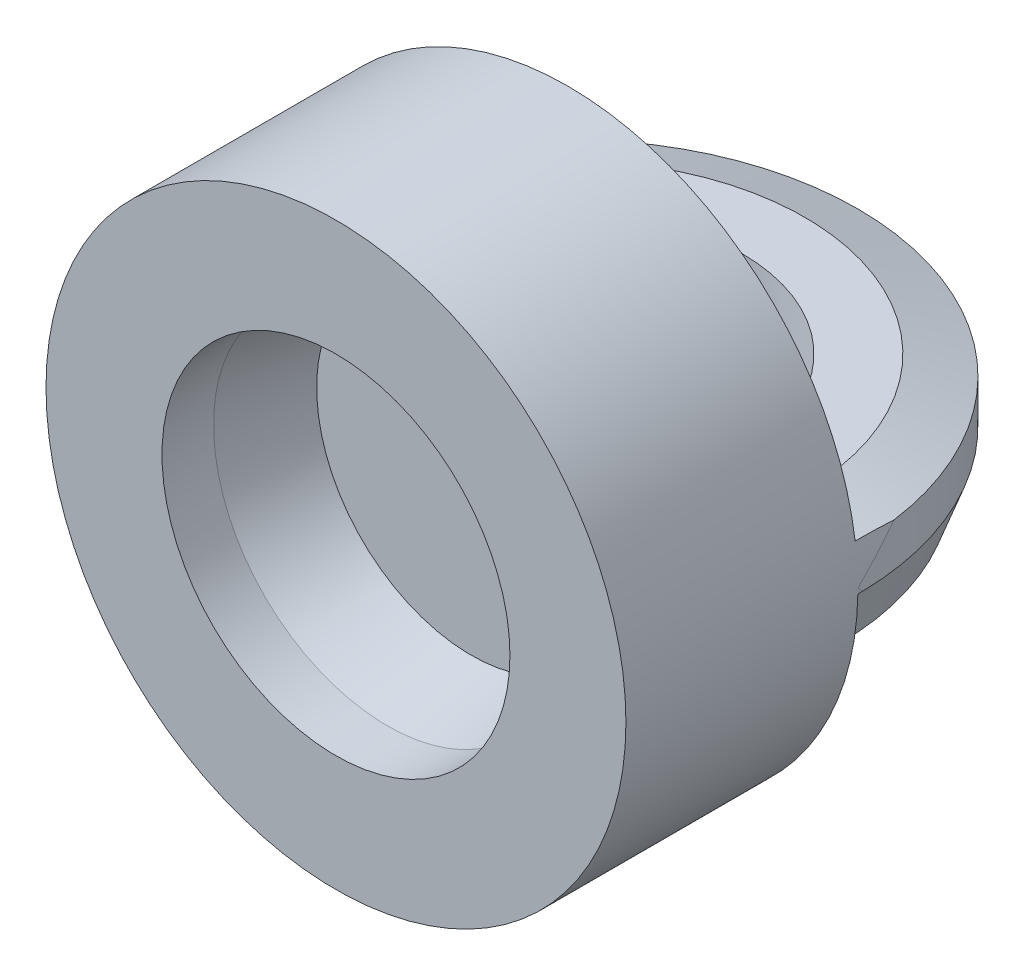
ISO-10303-21;
HEADER;
FILE_DESCRIPTION(('STEP AP214'),'2;1');
FILE_NAME('part.step','',(''),(''),'','','');
FILE_SCHEMA(('AUTOMOTIVE_DESIGN { 1 0 10303 214 1 1 1 1 }'));
ENDSEC;
DATA;
#1=APPLICATION_CONTEXT('core data for automotive mechanical design processes');
#2=APPLICATION_PROTOCOL_DEFINITION('international standard','automotive_design',2000,#1);
#3=PRODUCT_CONTEXT('',#1,'mechanical');
#4=PRODUCT('Part','Part','',(#3));
#5=PRODUCT_RELATED_PRODUCT_CATEGORY('part','',(#4));
#6=PRODUCT_DEFINITION_FORMATION('','',#4);
#7=PRODUCT_DEFINITION_CONTEXT('part definition',#1,'design');
#8=PRODUCT_DEFINITION('design','',#6,#7);
#9=PRODUCT_DEFINITION_SHAPE('','',#8);
#10=(LENGTH_UNIT() NAMED_UNIT(*) SI_UNIT(.MILLI.,.METRE.));
#11=(NAMED_UNIT(*) PLANE_ANGLE_UNIT() SI_UNIT($,.RADIAN.));
#12=(NAMED_UNIT(*) SI_UNIT($,.STERADIAN.) SOLID_ANGLE_UNIT());
#13=UNCERTAINTY_MEASURE_WITH_UNIT(LENGTH_MEASURE(1.E-05),#10,'distance_accuracy_value','');
#14=(GEOMETRIC_REPRESENTATION_CONTEXT(3) GLOBAL_UNCERTAINTY_ASSIGNED_CONTEXT((#13)) GLOBAL_UNIT_ASSIGNED_CONTEXT((#10,
#11,#12)) REPRESENTATION_CONTEXT('',''));
#15=CARTESIAN_POINT('',(0.,0.,0.));
#16=DIRECTION('',(0.,0.,1.));
#17=DIRECTION('',(1.,0.,0.));
#18=AXIS2_PLACEMENT_3D('',#15,#16,#17);
#19=CARTESIAN_POINT('',(0.,-1.5,0.));
#20=DIRECTION('',(0.,1.,0.));
#21=DIRECTION('',(0.,0.,1.));
#22=AXIS2_PLACEMENT_3D('',#19,#20,#21);
#23=CYLINDRICAL_SURFACE('',#22,7.5);
#24=CARTESIAN_POINT('',(0.,0.,0.));
#25=DIRECTION('',(0.,0.707106781186547,-0.707106781186547));
#26=DIRECTION('',(0.,0.707106781186547,0.707106781186547));
#27=AXIS2_PLACEMENT_3D('',#24,#25,#26);
#28=ELLIPSE('',#27,10.6066017177982,7.5);
#29=CARTESIAN_POINT('',(7.5,0.,0.));
#30=VERTEX_POINT('',#29);
#31=CARTESIAN_POINT('',(7.49893713045913,-0.126261290272685,-0.126261290272685));
#32=VERTEX_POINT('',#31);
#33=EDGE_CURVE('E115',#30,#32,#28,.T.);
#34=ORIENTED_EDGE('',*,*,#33,.T.);
#35=CARTESIAN_POINT('',(0.,-0.126261290272686,0.));
#36=DIRECTION('',(0.,-1.,0.));
#37=DIRECTION('',(0.,0.,-1.));
#38=AXIS2_PLACEMENT_3D('',#35,#36,#37);
#39=CIRCLE('',#38,7.5);
#40=CARTESIAN_POINT('',(-7.49893713045913,-0.126261290272684,-0.126261290272684));
#41=VERTEX_POINT('',#40);
#42=EDGE_CURVE('E139',#32,#41,#39,.F.);
#43=ORIENTED_EDGE('',*,*,#42,.T.);
#44=CARTESIAN_POINT('',(-7.5,0.,0.));
#45=VERTEX_POINT('',#44);
#46=EDGE_CURVE('E123',#41,#45,#28,.T.);
#47=ORIENTED_EDGE('',*,*,#46,.T.);
#48=CARTESIAN_POINT('',(0.,0.,0.));
#49=DIRECTION('',(0.,0.707106781186547,0.707106781186547));
#50=DIRECTION('',(0.,0.707106781186547,-0.707106781186547));
#51=AXIS2_PLACEMENT_3D('',#48,#49,#50);
#52=ELLIPSE('',#51,10.6066017177982,7.5);
#53=CARTESIAN_POINT('',(-7.43303437365925,0.999999999999996,-0.999999999999996));
#54=VERTEX_POINT('',#53);
#55=EDGE_CURVE('E125',#45,#54,#52,.F.);
#56=ORIENTED_EDGE('',*,*,#55,.T.);
#57=CARTESIAN_POINT('',(0.,0.999999999999996,0.));
#58=DIRECTION('',(0.,-1.,0.));
#59=DIRECTION('',(0.,0.,-1.));
#60=AXIS2_PLACEMENT_3D('',#57,#58,#59);
#61=CIRCLE('',#60,7.5);
#62=CARTESIAN_POINT('',(7.43303437365925,0.99999999999999,-0.99999999999999));
#63=VERTEX_POINT('',#62);
#64=EDGE_CURVE('E119',#54,#63,#61,.T.);
#65=ORIENTED_EDGE('',*,*,#64,.T.);
#66=EDGE_CURVE('E112',#63,#30,#52,.F.);
#67=ORIENTED_EDGE('',*,*,#66,.T.);
#68=EDGE_LOOP('',(#34,#43,#47,#56,#65,#67));
#69=FACE_BOUND('',#68,.T.);
#70=ADVANCED_FACE('F40',(#69),#23,.T.);
#71=CARTESIAN_POINT('',(0.,-1.5,0.));
#72=DIRECTION('',(0.,-1.,0.));
#73=DIRECTION('',(0.,0.,-1.));
#74=AXIS2_PLACEMENT_3D('',#71,#72,#73);
#75=PLANE('',#74);
#76=DIRECTION('',(1.,0.,0.));
#77=VECTOR('',#76,1.);
#78=CARTESIAN_POINT('',(0.,-1.5,0.));
#79=LINE('',#78,#77);
#80=CARTESIAN_POINT('',(-7.,-1.5,0.));
#81=VERTEX_POINT('',#80);
#82=CARTESIAN_POINT('',(-4.5,-1.5,0.));
#83=VERTEX_POINT('',#82);
#84=EDGE_CURVE('E140',#81,#83,#79,.T.);
#85=ORIENTED_EDGE('',*,*,#84,.F.);
#86=CARTESIAN_POINT('',(0.,-1.5,0.));
#87=DIRECTION('',(0.,-1.,0.));
#88=DIRECTION('',(0.,0.,-1.));
#89=AXIS2_PLACEMENT_3D('',#86,#87,#88);
#90=CIRCLE('',#89,7.);
#91=CARTESIAN_POINT('',(7.,-1.5,0.));
#92=VERTEX_POINT('',#91);
#93=EDGE_CURVE('E261',#81,#92,#90,.T.);
#94=ORIENTED_EDGE('',*,*,#93,.T.);
#95=DIRECTION('',(1.,0.,0.));
#96=VECTOR('',#95,1.);
#97=CARTESIAN_POINT('',(4.5,-1.5,0.));
#98=LINE('',#97,#96);
#99=CARTESIAN_POINT('',(4.5,-1.5,0.));
#100=VERTEX_POINT('',#99);
#101=EDGE_CURVE('E256',#100,#92,#98,.T.);
#102=ORIENTED_EDGE('',*,*,#101,.F.);
#103=CARTESIAN_POINT('',(0.,-1.5,0.));
#104=DIRECTION('',(0.,-1.,0.));
#105=DIRECTION('',(0.,0.,-1.));
#106=AXIS2_PLACEMENT_3D('',#103,#104,#105);
#107=CIRCLE('',#106,4.5);
#108=EDGE_CURVE('E253',#83,#100,#107,.T.);
#109=ORIENTED_EDGE('',*,*,#108,.F.);
#110=EDGE_LOOP('',(#85,#94,#102,#109));
#111=FACE_BOUND('',#110,.T.);
#112=ADVANCED_FACE('F200',(#111),#75,.T.);
#113=CARTESIAN_POINT('',(0.,1.5,0.));
#114=DIRECTION('',(0.,-1.,0.));
#115=DIRECTION('',(0.,0.,-1.));
#116=AXIS2_PLACEMENT_3D('',#113,#114,#115);
#117=PLANE('',#116);
#118=DIRECTION('',(1.,0.,0.));
#119=VECTOR('',#118,1.);
#120=CARTESIAN_POINT('',(4.5,1.5,0.));
#121=LINE('',#120,#119);
#122=CARTESIAN_POINT('',(4.5,1.5,0.));
#123=VERTEX_POINT('',#122);
#124=CARTESIAN_POINT('',(6.12626129027268,1.5,0.));
#125=VERTEX_POINT('',#124);
#126=EDGE_CURVE('E133',#123,#125,#121,.T.);
#127=ORIENTED_EDGE('',*,*,#126,.T.);
#128=CARTESIAN_POINT('',(0.,1.5,0.));
#129=DIRECTION('',(0.,-1.,0.));
#130=DIRECTION('',(0.,0.,-1.));
#131=AXIS2_PLACEMENT_3D('',#128,#129,#130);
#132=CIRCLE('',#131,6.12626129027268);
#133=CARTESIAN_POINT('',(-6.12626129027268,1.5,0.));
#134=VERTEX_POINT('',#133);
#135=EDGE_CURVE('E244',#125,#134,#132,.F.);
#136=ORIENTED_EDGE('',*,*,#135,.T.);
#137=DIRECTION('',(1.,0.,0.));
#138=VECTOR('',#137,1.);
#139=CARTESIAN_POINT('',(0.,1.5,0.));
#140=LINE('',#139,#138);
#141=CARTESIAN_POINT('',(-4.5,1.5,0.));
#142=VERTEX_POINT('',#141);
#143=EDGE_CURVE('E143',#134,#142,#140,.T.);
#144=ORIENTED_EDGE('',*,*,#143,.T.);
#145=CARTESIAN_POINT('',(0.,1.5,0.));
#146=DIRECTION('',(0.,-1.,0.));
#147=DIRECTION('',(0.,0.,-1.));
#148=AXIS2_PLACEMENT_3D('',#145,#146,#147);
#149=CIRCLE('',#148,4.5);
#150=EDGE_CURVE('E130',#142,#123,#149,.T.);
#151=ORIENTED_EDGE('',*,*,#150,.T.);
#152=EDGE_LOOP('',(#127,#136,#144,#151));
#153=FACE_BOUND('',#152,.T.);
#154=ADVANCED_FACE('F163',(#153),#117,.F.);
#155=CARTESIAN_POINT('',(0.,0.,6.));
#156=DIRECTION('',(0.,0.,-1.));
#157=DIRECTION('',(-1.,0.,0.));
#158=AXIS2_PLACEMENT_3D('',#155,#156,#157);
#159=CYLINDRICAL_SURFACE('',#158,7.5);
#160=CARTESIAN_POINT('',(0.,0.,6.));
#161=DIRECTION('',(0.,0.,1.));
#162=DIRECTION('',(1.,0.,0.));
#163=AXIS2_PLACEMENT_3D('',#160,#161,#162);
#164=CIRCLE('',#163,7.5);
#165=CARTESIAN_POINT('',(7.5,0.,6.));
#166=VERTEX_POINT('',#165);
#167=EDGE_CURVE('E227',#166,#166,#164,.T.);
#168=ORIENTED_EDGE('',*,*,#167,.F.);
#169=EDGE_LOOP('',(#168));
#170=FACE_BOUND('',#169,.T.);
#171=CARTESIAN_POINT('',(-7.49893713045913,-0.126261290272686,-0.126261290272686));
#172=CARTESIAN_POINT('',(-7.49891981509482,-0.127281952413126,-0.105230121818017));
#173=CARTESIAN_POINT('',(-7.49890680662613,-0.128047588009743,-0.0841927635166021));
#174=CARTESIAN_POINT('',(-7.49888940347976,-0.129068806126517,-0.0421056667593014));
#175=CARTESIAN_POINT('',(-7.49888500880228,-0.129324388635501,-0.0210559283031444));
#176=CARTESIAN_POINT('',(-7.4988849210206,-0.129324944589488,0.));
#177=B_SPLINE_CURVE_WITH_KNOTS('',3,(#171,#172,#173,#174,#175,#176),.UNSPECIFIED.,.F.,.F.,(4,2,
4),(0.,0.0631538700516648,0.126307741486774),.UNSPECIFIED.);
#178=CARTESIAN_POINT('',(-7.49888492102038,-0.129324944590104,0.));
#179=VERTEX_POINT('',#178);
#180=EDGE_CURVE('E177',#41,#179,#177,.T.);
#181=ORIENTED_EDGE('',*,*,#180,.T.);
#182=CARTESIAN_POINT('',(0.,0.,0.));
#183=DIRECTION('',(0.,0.,1.));
#184=DIRECTION('',(1.,0.,0.));
#185=AXIS2_PLACEMENT_3D('',#182,#183,#184);
#186=CIRCLE('',#185,7.5);
#187=CARTESIAN_POINT('',(7.49888492102037,-0.129324944590112,0.));
#188=VERTEX_POINT('',#187);
#189=EDGE_CURVE('E234',#179,#188,#186,.T.);
#190=ORIENTED_EDGE('',*,*,#189,.T.);
#191=CARTESIAN_POINT('',(7.49888492102037,-0.129324944590112,0.));
#192=CARTESIAN_POINT('',(7.49888500880213,-0.129324388635918,-0.021055928303172));
#193=CARTESIAN_POINT('',(7.49888940347968,-0.129068806126727,-0.0421056667593241));
#194=CARTESIAN_POINT('',(7.4989068066262,-0.128047588009534,-0.0841927635166148));
#195=CARTESIAN_POINT('',(7.49891981509498,-0.127281952412706,-0.105230121818025));
#196=CARTESIAN_POINT('',(7.49893713045936,-0.126261290272053,-0.126261290272686));
#197=B_SPLINE_CURVE_WITH_KNOTS('',3,(#191,#192,#193,#194,#195,#196),.UNSPECIFIED.,.F.,.F.,(4,2,
4),(0.,0.0631538714351022,0.126307741486775),.UNSPECIFIED.);
#198=EDGE_CURVE('E129',#188,#32,#197,.T.);
#199=ORIENTED_EDGE('',*,*,#198,.T.);
#200=ORIENTED_EDGE('',*,*,#33,.F.);
#201=ORIENTED_EDGE('',*,*,#66,.F.);
#202=CARTESIAN_POINT('',(7.43303437365925,0.999999999999996,-0.999999999999996));
#203=CARTESIAN_POINT('',(7.43187778288891,1.00852762046875,-0.83344455051431));
#204=CARTESIAN_POINT('',(7.43100821305235,1.01492857048535,-0.666833557880001));
#205=CARTESIAN_POINT('',(7.42984311433243,1.023477136323,-0.333500224721026));
#206=CARTESIAN_POINT('',(7.42954758635006,1.02562474546817,-0.166777884022003));
#207=CARTESIAN_POINT('',(7.42953908020246,1.02564567748532,0.));
#208=B_SPLINE_CURVE_WITH_KNOTS('',3,(#202,#203,#204,#205,#206,#207),.UNSPECIFIED.,.F.,.F.,(4,2,
4),(0.,0.500208517135255,1.00041781937773),.UNSPECIFIED.);
#209=CARTESIAN_POINT('',(7.42953908020249,1.02564567748531,0.));
#210=VERTEX_POINT('',#209);
#211=EDGE_CURVE('E138',#63,#210,#208,.T.);
#212=ORIENTED_EDGE('',*,*,#211,.T.);
#213=CARTESIAN_POINT('',(-7.42953908020265,1.02564567748525,0.));
#214=VERTEX_POINT('',#213);
#215=EDGE_CURVE('E229',#210,#214,#186,.T.);
#216=ORIENTED_EDGE('',*,*,#215,.T.);
#217=CARTESIAN_POINT('',(-7.42953908020265,1.02564567748525,0.));
#218=CARTESIAN_POINT('',(-7.42954758635015,1.02562474546814,-0.166777884022003));
#219=CARTESIAN_POINT('',(-7.42984311433246,1.02347713632299,-0.333500224721026));
#220=CARTESIAN_POINT('',(-7.43100821305232,1.01492857048536,-0.666833557880002));
#221=CARTESIAN_POINT('',(-7.43187778288888,1.00852762046876,-0.833444550514311));
#222=CARTESIAN_POINT('',(-7.43303437365925,0.999999999999996,-0.999999999999996));
#223=B_SPLINE_CURVE_WITH_KNOTS('',3,(#217,#218,#219,#220,#221,#222),.UNSPECIFIED.,.F.,.F.,(4,2,
4),(0.,0.500209302242479,1.00041781937773),.UNSPECIFIED.);
#224=EDGE_CURVE('E137',#214,#54,#223,.T.);
#225=ORIENTED_EDGE('',*,*,#224,.T.);
#226=ORIENTED_EDGE('',*,*,#55,.F.);
#227=ORIENTED_EDGE('',*,*,#46,.F.);
#228=EDGE_LOOP('',(#181,#190,#199,#200,#201,#212,#216,#225,#226,#227));
#229=FACE_BOUND('',#228,.T.);
#230=ADVANCED_FACE('F127',(#170,#229),#159,.T.);
#231=CARTESIAN_POINT('',(0.,0.,6.));
#232=DIRECTION('',(0.,0.,1.));
#233=DIRECTION('',(1.,0.,0.));
#234=AXIS2_PLACEMENT_3D('',#231,#232,#233);
#235=PLANE('',#234);
#236=CARTESIAN_POINT('',(0.,0.,6.));
#237=DIRECTION('',(0.,0.,1.));
#238=DIRECTION('',(1.,0.,0.));
#239=AXIS2_PLACEMENT_3D('',#236,#237,#238);
#240=CIRCLE('',#239,4.5);
#241=CARTESIAN_POINT('',(4.5,0.,6.));
#242=VERTEX_POINT('',#241);
#243=EDGE_CURVE('E224',#242,#242,#240,.T.);
#244=ORIENTED_EDGE('',*,*,#243,.F.);
#245=EDGE_LOOP('',(#244));
#246=FACE_BOUND('',#245,.T.);
#247=ORIENTED_EDGE('',*,*,#167,.T.);
#248=EDGE_LOOP('',(#247));
#249=FACE_BOUND('',#248,.T.);
#250=ADVANCED_FACE('F162',(#246,#249),#235,.T.);
#251=CARTESIAN_POINT('',(0.,0.,0.));
#252=DIRECTION('',(0.,0.,1.));
#253=DIRECTION('',(1.,0.,0.));
#254=AXIS2_PLACEMENT_3D('',#251,#252,#253);
#255=PLANE('',#254);
#256=ORIENTED_EDGE('',*,*,#189,.F.);
#257=DIRECTION('',(0.34202014332567,-0.939692620785908,0.));
#258=VECTOR('',#257,1.);
#259=CARTESIAN_POINT('',(0.,-20.7323419361823,0.));
#260=LINE('',#259,#258);
#261=EDGE_CURVE('E260',#179,#81,#260,.T.);
#262=ORIENTED_EDGE('',*,*,#261,.T.);
#263=ORIENTED_EDGE('',*,*,#84,.T.);
#264=DIRECTION('',(0.,1.,0.));
#265=VECTOR('',#264,1.);
#266=CARTESIAN_POINT('',(-4.5,-1.5,0.));
#267=LINE('',#266,#265);
#268=EDGE_CURVE('E246',#83,#142,#267,.T.);
#269=ORIENTED_EDGE('',*,*,#268,.T.);
#270=ORIENTED_EDGE('',*,*,#143,.F.);
#271=DIRECTION('',(-0.939692620785908,-0.34202014332567,0.));
#272=VECTOR('',#271,1.);
#273=CARTESIAN_POINT('',(0.,3.72977675699652,0.));
#274=LINE('',#273,#272);
#275=EDGE_CURVE('E50',#134,#214,#274,.T.);
#276=ORIENTED_EDGE('',*,*,#275,.T.);
#277=ORIENTED_EDGE('',*,*,#215,.F.);
#278=DIRECTION('',(-0.939692620785908,0.34202014332567,0.));
#279=VECTOR('',#278,1.);
#280=CARTESIAN_POINT('',(0.,3.72977675699652,0.));
#281=LINE('',#280,#279);
#282=EDGE_CURVE('E12',#210,#125,#281,.T.);
#283=ORIENTED_EDGE('',*,*,#282,.T.);
#284=ORIENTED_EDGE('',*,*,#126,.F.);
#285=DIRECTION('',(0.,1.,0.));
#286=VECTOR('',#285,1.);
#287=CARTESIAN_POINT('',(4.5,-1.5,0.));
#288=LINE('',#287,#286);
#289=EDGE_CURVE('E250',#100,#123,#288,.T.);
#290=ORIENTED_EDGE('',*,*,#289,.F.);
#291=ORIENTED_EDGE('',*,*,#101,.T.);
#292=DIRECTION('',(0.34202014332567,0.939692620785908,0.));
#293=VECTOR('',#292,1.);
#294=CARTESIAN_POINT('',(0.,-20.7323419361823,0.));
#295=LINE('',#294,#293);
#296=EDGE_CURVE('E263',#92,#188,#295,.T.);
#297=ORIENTED_EDGE('',*,*,#296,.T.);
#298=EDGE_LOOP('',(#256,#262,#263,#269,#270,#276,#277,#283,#284,#290,#291,#297));
#299=FACE_BOUND('',#298,.T.);
#300=ADVANCED_FACE('F165',(#299),#255,.F.);
#301=CARTESIAN_POINT('',(0.,0.,2.5));
#302=DIRECTION('',(0.,0.,1.));
#303=DIRECTION('',(1.,0.,0.));
#304=AXIS2_PLACEMENT_3D('',#301,#302,#303);
#305=CYLINDRICAL_SURFACE('',#304,4.5);
#306=CARTESIAN_POINT('',(0.,0.,4.66573793714213));
#307=DIRECTION('',(0.,0.,1.));
#308=DIRECTION('',(1.,0.,0.));
#309=AXIS2_PLACEMENT_3D('',#306,#307,#308);
#310=CIRCLE('',#309,4.5);
#311=CARTESIAN_POINT('',(4.5,0.,4.66573793714213));
#312=VERTEX_POINT('',#311);
#313=EDGE_CURVE('E232',#312,#312,#310,.F.);
#314=ORIENTED_EDGE('',*,*,#313,.T.);
#315=EDGE_LOOP('',(#314));
#316=FACE_BOUND('',#315,.T.);
#317=ORIENTED_EDGE('',*,*,#243,.T.);
#318=EDGE_LOOP('',(#317));
#319=FACE_BOUND('',#318,.T.);
#320=ADVANCED_FACE('F212',(#316,#319),#305,.F.);
#321=CARTESIAN_POINT('',(0.,0.,2.5));
#322=DIRECTION('',(0.,0.,1.));
#323=DIRECTION('',(1.,0.,0.));
#324=AXIS2_PLACEMENT_3D('',#321,#322,#323);
#325=PLANE('',#324);
#326=CARTESIAN_POINT('',(0.,0.,2.5));
#327=DIRECTION('',(0.,0.,1.));
#328=DIRECTION('',(1.,0.,0.));
#329=AXIS2_PLACEMENT_3D('',#326,#327,#328);
#330=CIRCLE('',#329,4.);
#331=CARTESIAN_POINT('',(4.,0.,2.5));
#332=VERTEX_POINT('',#331);
#333=EDGE_CURVE('E228',#332,#332,#330,.T.);
#334=ORIENTED_EDGE('',*,*,#333,.T.);
#335=EDGE_LOOP('',(#334));
#336=FACE_BOUND('',#335,.T.);
#337=ADVANCED_FACE('F209',(#336),#325,.T.);
#338=CARTESIAN_POINT('',(0.,0.,2.5));
#339=DIRECTION('',(0.,0.,1.));
#340=DIRECTION('',(1.,0.,0.));
#341=AXIS2_PLACEMENT_3D('',#338,#339,#340);
#342=CONICAL_SURFACE('',#341,4.,0.226892802759257);
#343=ORIENTED_EDGE('',*,*,#313,.F.);
#344=EDGE_LOOP('',(#343));
#345=FACE_BOUND('',#344,.T.);
#346=ORIENTED_EDGE('',*,*,#333,.F.);
#347=EDGE_LOOP('',(#346));
#348=FACE_BOUND('',#347,.T.);
#349=ADVANCED_FACE('F168',(#345,#348),#342,.F.);
#350=CARTESIAN_POINT('',(0.,-1.5,0.));
#351=DIRECTION('',(0.,1.,0.));
#352=DIRECTION('',(0.,0.,1.));
#353=AXIS2_PLACEMENT_3D('',#350,#351,#352);
#354=CYLINDRICAL_SURFACE('',#353,4.5);
#355=ORIENTED_EDGE('',*,*,#289,.T.);
#356=ORIENTED_EDGE('',*,*,#150,.F.);
#357=ORIENTED_EDGE('',*,*,#268,.F.);
#358=ORIENTED_EDGE('',*,*,#108,.T.);
#359=EDGE_LOOP('',(#355,#356,#357,#358));
#360=FACE_BOUND('',#359,.T.);
#361=ADVANCED_FACE('F189',(#360),#354,.F.);
#362=CARTESIAN_POINT('',(0.,-0.126261290272686,0.));
#363=DIRECTION('',(0.,1.,0.));
#364=DIRECTION('',(0.,0.,1.));
#365=AXIS2_PLACEMENT_3D('',#362,#363,#364);
#366=CONICAL_SURFACE('',#365,7.5,0.349065850398867);
#367=ORIENTED_EDGE('',*,*,#296,.F.);
#368=ORIENTED_EDGE('',*,*,#93,.F.);
#369=ORIENTED_EDGE('',*,*,#261,.F.);
#370=ORIENTED_EDGE('',*,*,#180,.F.);
#371=ORIENTED_EDGE('',*,*,#42,.F.);
#372=ORIENTED_EDGE('',*,*,#198,.F.);
#373=EDGE_LOOP('',(#367,#368,#369,#370,#371,#372));
#374=FACE_BOUND('',#373,.T.);
#375=ADVANCED_FACE('F184',(#374),#366,.T.);
#376=CARTESIAN_POINT('',(0.,1.5,0.));
#377=DIRECTION('',(0.,-1.,0.));
#378=DIRECTION('',(0.,0.,-1.));
#379=AXIS2_PLACEMENT_3D('',#376,#377,#378);
#380=CONICAL_SURFACE('',#379,6.12626129027268,1.22173047639603);
#381=ORIENTED_EDGE('',*,*,#211,.F.);
#382=ORIENTED_EDGE('',*,*,#64,.F.);
#383=ORIENTED_EDGE('',*,*,#224,.F.);
#384=ORIENTED_EDGE('',*,*,#275,.F.);
#385=ORIENTED_EDGE('',*,*,#135,.F.);
#386=ORIENTED_EDGE('',*,*,#282,.F.);
#387=EDGE_LOOP('',(#381,#382,#383,#384,#385,#386));
#388=FACE_BOUND('',#387,.T.);
#389=ADVANCED_FACE('F43',(#388),#380,.T.);
#390=CLOSED_SHELL('',(#70,#112,#154,#230,#250,#300,#320,#337,#349,#361,#375,#389));
#391=MANIFOLD_SOLID_BREP('B2',#390);
#392=ADVANCED_BREP_SHAPE_REPRESENTATION('',(#18,#391),#14);
#393=SHAPE_DEFINITION_REPRESENTATION(#9,#392);
ENDSEC;
END-ISO-10303-21;
